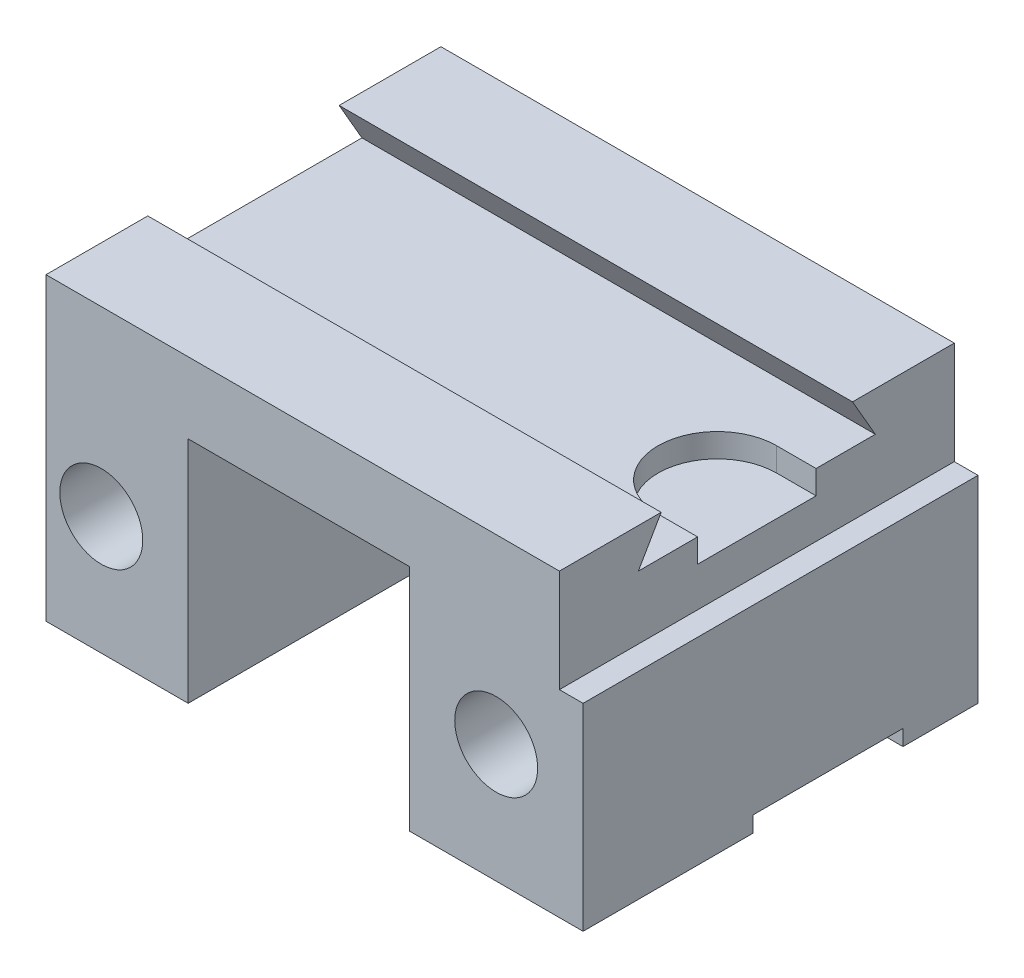
ISO-10303-21;
HEADER;
FILE_DESCRIPTION(('STEP AP214'),'2;1');
FILE_NAME('part.step','',(''),(''),'','','');
FILE_SCHEMA(('AUTOMOTIVE_DESIGN { 1 0 10303 214 1 1 1 1 }'));
ENDSEC;
DATA;
#1=APPLICATION_CONTEXT('core data for automotive mechanical design processes');
#2=APPLICATION_PROTOCOL_DEFINITION('international standard','automotive_design',2000,#1);
#3=PRODUCT_CONTEXT('',#1,'mechanical');
#4=PRODUCT('Part','Part','',(#3));
#5=PRODUCT_RELATED_PRODUCT_CATEGORY('part','',(#4));
#6=PRODUCT_DEFINITION_FORMATION('','',#4);
#7=PRODUCT_DEFINITION_CONTEXT('part definition',#1,'design');
#8=PRODUCT_DEFINITION('design','',#6,#7);
#9=PRODUCT_DEFINITION_SHAPE('','',#8);
#10=(LENGTH_UNIT() NAMED_UNIT(*) SI_UNIT(.MILLI.,.METRE.));
#11=(NAMED_UNIT(*) PLANE_ANGLE_UNIT() SI_UNIT($,.RADIAN.));
#12=(NAMED_UNIT(*) SI_UNIT($,.STERADIAN.) SOLID_ANGLE_UNIT());
#13=UNCERTAINTY_MEASURE_WITH_UNIT(LENGTH_MEASURE(1.E-05),#10,'distance_accuracy_value','');
#14=(GEOMETRIC_REPRESENTATION_CONTEXT(3) GLOBAL_UNCERTAINTY_ASSIGNED_CONTEXT((#13)) GLOBAL_UNIT_ASSIGNED_CONTEXT((#10,
#11,#12)) REPRESENTATION_CONTEXT('',''));
#15=CARTESIAN_POINT('',(0.,0.,0.));
#16=DIRECTION('',(0.,0.,1.));
#17=DIRECTION('',(1.,0.,0.));
#18=AXIS2_PLACEMENT_3D('',#15,#16,#17);
#19=CARTESIAN_POINT('',(0.,3.5,0.));
#20=DIRECTION('',(0.,-1.,0.));
#21=DIRECTION('',(0.,0.,-1.));
#22=AXIS2_PLACEMENT_3D('',#19,#20,#21);
#23=PLANE('',#22);
#24=DIRECTION('',(0.,0.,1.));
#25=VECTOR('',#24,1.);
#26=CARTESIAN_POINT('',(6.5,3.5,0.));
#27=LINE('',#26,#25);
#28=CARTESIAN_POINT('',(6.5,3.5,1.));
#29=VERTEX_POINT('',#28);
#30=CARTESIAN_POINT('',(6.5,3.5,1.75));
#31=VERTEX_POINT('',#30);
#32=EDGE_CURVE('E221',#29,#31,#27,.T.);
#33=ORIENTED_EDGE('',*,*,#32,.F.);
#34=DIRECTION('',(1.,0.,0.));
#35=VECTOR('',#34,1.);
#36=CARTESIAN_POINT('',(0.,3.5,1.));
#37=LINE('',#36,#35);
#38=CARTESIAN_POINT('',(0.,3.5,1.));
#39=VERTEX_POINT('',#38);
#40=EDGE_CURVE('E255',#39,#29,#37,.T.);
#41=ORIENTED_EDGE('',*,*,#40,.F.);
#42=DIRECTION('',(0.,0.,-1.));
#43=VECTOR('',#42,1.);
#44=CARTESIAN_POINT('',(0.,3.5,0.));
#45=LINE('',#44,#43);
#46=CARTESIAN_POINT('',(0.,3.5,4.));
#47=VERTEX_POINT('',#46);
#48=EDGE_CURVE('E245',#47,#39,#45,.T.);
#49=ORIENTED_EDGE('',*,*,#48,.F.);
#50=DIRECTION('',(1.,0.,0.));
#51=VECTOR('',#50,1.);
#52=CARTESIAN_POINT('',(0.,3.5,4.));
#53=LINE('',#52,#51);
#54=CARTESIAN_POINT('',(6.5,3.5,4.));
#55=VERTEX_POINT('',#54);
#56=EDGE_CURVE('E256',#47,#55,#53,.T.);
#57=ORIENTED_EDGE('',*,*,#56,.T.);
#58=CARTESIAN_POINT('',(6.5,3.5,3.25));
#59=VERTEX_POINT('',#58);
#60=EDGE_CURVE('E219',#59,#55,#27,.T.);
#61=ORIENTED_EDGE('',*,*,#60,.F.);
#62=DIRECTION('',(1.,0.,0.));
#63=VECTOR('',#62,1.);
#64=CARTESIAN_POINT('',(0.,3.5,3.25));
#65=LINE('',#64,#63);
#66=CARTESIAN_POINT('',(6.,3.5,3.25));
#67=VERTEX_POINT('',#66);
#68=EDGE_CURVE('E238',#67,#59,#65,.T.);
#69=ORIENTED_EDGE('',*,*,#68,.F.);
#70=CARTESIAN_POINT('',(6.,3.5,2.5));
#71=DIRECTION('',(0.,1.,0.));
#72=DIRECTION('',(0.,0.,1.));
#73=AXIS2_PLACEMENT_3D('',#70,#71,#72);
#74=CIRCLE('',#73,0.75);
#75=CARTESIAN_POINT('',(6.,3.5,1.75));
#76=VERTEX_POINT('',#75);
#77=EDGE_CURVE('E59',#76,#67,#74,.T.);
#78=ORIENTED_EDGE('',*,*,#77,.F.);
#79=DIRECTION('',(1.,0.,0.));
#80=VECTOR('',#79,1.);
#81=CARTESIAN_POINT('',(0.,3.5,1.75));
#82=LINE('',#81,#80);
#83=EDGE_CURVE('E230',#76,#31,#82,.T.);
#84=ORIENTED_EDGE('',*,*,#83,.T.);
#85=EDGE_LOOP('',(#33,#41,#49,#57,#61,#69,#78,#84));
#86=FACE_BOUND('',#85,.T.);
#87=ADVANCED_FACE('F37',(#86),#23,.F.);
#88=CARTESIAN_POINT('',(0.,4.,0.));
#89=DIRECTION('',(0.,1.,0.));
#90=DIRECTION('',(0.,0.,1.));
#91=AXIS2_PLACEMENT_3D('',#88,#89,#90);
#92=PLANE('',#91);
#93=DIRECTION('',(1.,0.,0.));
#94=VECTOR('',#93,1.);
#95=CARTESIAN_POINT('',(0.,4.,5.));
#96=LINE('',#95,#94);
#97=CARTESIAN_POINT('',(0.,4.,5.));
#98=VERTEX_POINT('',#97);
#99=CARTESIAN_POINT('',(6.5,4.,5.));
#100=VERTEX_POINT('',#99);
#101=EDGE_CURVE('E367',#98,#100,#96,.T.);
#102=ORIENTED_EDGE('',*,*,#101,.T.);
#103=DIRECTION('',(0.,0.,1.));
#104=VECTOR('',#103,1.);
#105=CARTESIAN_POINT('',(6.5,4.,5.));
#106=LINE('',#105,#104);
#107=CARTESIAN_POINT('',(6.5,4.,3.71132486540518));
#108=VERTEX_POINT('',#107);
#109=EDGE_CURVE('E199',#108,#100,#106,.T.);
#110=ORIENTED_EDGE('',*,*,#109,.F.);
#111=DIRECTION('',(1.,0.,0.));
#112=VECTOR('',#111,1.);
#113=CARTESIAN_POINT('',(0.,4.,3.71132486540518));
#114=LINE('',#113,#112);
#115=CARTESIAN_POINT('',(0.,4.,3.71132486540518));
#116=VERTEX_POINT('',#115);
#117=EDGE_CURVE('E260',#116,#108,#114,.T.);
#118=ORIENTED_EDGE('',*,*,#117,.F.);
#119=DIRECTION('',(0.,0.,1.));
#120=VECTOR('',#119,1.);
#121=CARTESIAN_POINT('',(0.,4.,0.));
#122=LINE('',#121,#120);
#123=EDGE_CURVE('E363',#116,#98,#122,.T.);
#124=ORIENTED_EDGE('',*,*,#123,.T.);
#125=EDGE_LOOP('',(#102,#110,#118,#124));
#126=FACE_BOUND('',#125,.T.);
#127=ADVANCED_FACE('F413',(#126),#92,.T.);
#128=DIRECTION('',(1.,0.,0.));
#129=VECTOR('',#128,1.);
#130=CARTESIAN_POINT('',(0.,4.,1.28867513459482));
#131=LINE('',#130,#129);
#132=CARTESIAN_POINT('',(0.,4.,1.28867513459482));
#133=VERTEX_POINT('',#132);
#134=CARTESIAN_POINT('',(6.5,4.,1.28867513459482));
#135=VERTEX_POINT('',#134);
#136=EDGE_CURVE('E263',#133,#135,#131,.T.);
#137=ORIENTED_EDGE('',*,*,#136,.T.);
#138=CARTESIAN_POINT('',(6.5,4.,0.));
#139=VERTEX_POINT('',#138);
#140=EDGE_CURVE('E210',#139,#135,#106,.T.);
#141=ORIENTED_EDGE('',*,*,#140,.F.);
#142=DIRECTION('',(-1.,0.,0.));
#143=VECTOR('',#142,1.);
#144=CARTESIAN_POINT('',(6.8,4.,0.));
#145=LINE('',#144,#143);
#146=CARTESIAN_POINT('',(0.,4.,0.));
#147=VERTEX_POINT('',#146);
#148=EDGE_CURVE('E337',#139,#147,#145,.T.);
#149=ORIENTED_EDGE('',*,*,#148,.T.);
#150=EDGE_CURVE('E364',#147,#133,#122,.T.);
#151=ORIENTED_EDGE('',*,*,#150,.T.);
#152=EDGE_LOOP('',(#137,#141,#149,#151));
#153=FACE_BOUND('',#152,.T.);
#154=ADVANCED_FACE('F386',(#153),#92,.T.);
#155=CARTESIAN_POINT('',(0.,2.6070508075689,4.51554445662276));
#156=DIRECTION('',(0.,0.500000000000004,0.866025403784436));
#157=DIRECTION('',(0.,-0.866025403784436,0.500000000000004));
#158=AXIS2_PLACEMENT_3D('',#155,#156,#157);
#159=PLANE('',#158);
#160=DIRECTION('',(0.,0.866025403784436,-0.500000000000004));
#161=VECTOR('',#160,1.);
#162=CARTESIAN_POINT('',(6.5,2.6070508075689,4.51554445662276));
#163=LINE('',#162,#161);
#164=EDGE_CURVE('E224',#55,#108,#163,.T.);
#165=ORIENTED_EDGE('',*,*,#164,.F.);
#166=ORIENTED_EDGE('',*,*,#56,.F.);
#167=DIRECTION('',(0.,-0.866025403784436,0.500000000000004));
#168=VECTOR('',#167,1.);
#169=CARTESIAN_POINT('',(0.,2.6070508075689,4.51554445662276));
#170=LINE('',#169,#168);
#171=EDGE_CURVE('E252',#116,#47,#170,.T.);
#172=ORIENTED_EDGE('',*,*,#171,.F.);
#173=ORIENTED_EDGE('',*,*,#117,.T.);
#174=EDGE_LOOP('',(#165,#166,#172,#173));
#175=FACE_BOUND('',#174,.T.);
#176=ADVANCED_FACE('F410',(#175),#159,.F.);
#177=CARTESIAN_POINT('',(0.,0.441987298107791,-0.765544456622779));
#178=DIRECTION('',(0.,0.500000000000004,-0.866025403784437));
#179=DIRECTION('',(0.,0.866025403784437,0.500000000000004));
#180=AXIS2_PLACEMENT_3D('',#177,#178,#179);
#181=PLANE('',#180);
#182=DIRECTION('',(0.,-0.866025403784437,-0.500000000000004));
#183=VECTOR('',#182,1.);
#184=CARTESIAN_POINT('',(6.5,0.441987298107791,-0.765544456622779));
#185=LINE('',#184,#183);
#186=EDGE_CURVE('E222',#135,#29,#185,.T.);
#187=ORIENTED_EDGE('',*,*,#186,.F.);
#188=ORIENTED_EDGE('',*,*,#136,.F.);
#189=DIRECTION('',(0.,0.866025403784437,0.500000000000004));
#190=VECTOR('',#189,1.);
#191=CARTESIAN_POINT('',(0.,0.441987298107791,-0.765544456622779));
#192=LINE('',#191,#190);
#193=EDGE_CURVE('E249',#39,#133,#192,.T.);
#194=ORIENTED_EDGE('',*,*,#193,.F.);
#195=ORIENTED_EDGE('',*,*,#40,.T.);
#196=EDGE_LOOP('',(#187,#188,#194,#195));
#197=FACE_BOUND('',#196,.T.);
#198=ADVANCED_FACE('F391',(#197),#181,.F.);
#199=CARTESIAN_POINT('',(0.,3.2,1.75));
#200=DIRECTION('',(0.,0.,1.));
#201=DIRECTION('',(1.,0.,0.));
#202=AXIS2_PLACEMENT_3D('',#199,#200,#201);
#203=PLANE('',#202);
#204=DIRECTION('',(1.,0.,0.));
#205=VECTOR('',#204,1.);
#206=CARTESIAN_POINT('',(0.,3.2,1.75));
#207=LINE('',#206,#205);
#208=CARTESIAN_POINT('',(6.,3.2,1.75));
#209=VERTEX_POINT('',#208);
#210=CARTESIAN_POINT('',(6.5,3.2,1.75));
#211=VERTEX_POINT('',#210);
#212=EDGE_CURVE('E233',#209,#211,#207,.T.);
#213=ORIENTED_EDGE('',*,*,#212,.T.);
#214=DIRECTION('',(0.,1.,0.));
#215=VECTOR('',#214,1.);
#216=CARTESIAN_POINT('',(6.5,3.2,1.75));
#217=LINE('',#216,#215);
#218=EDGE_CURVE('E52',#211,#31,#217,.T.);
#219=ORIENTED_EDGE('',*,*,#218,.T.);
#220=ORIENTED_EDGE('',*,*,#83,.F.);
#221=DIRECTION('',(0.,1.,0.));
#222=VECTOR('',#221,1.);
#223=CARTESIAN_POINT('',(6.,3.2,1.75));
#224=LINE('',#223,#222);
#225=EDGE_CURVE('E243',#209,#76,#224,.T.);
#226=ORIENTED_EDGE('',*,*,#225,.F.);
#227=EDGE_LOOP('',(#213,#219,#220,#226));
#228=FACE_BOUND('',#227,.T.);
#229=ADVANCED_FACE('F396',(#228),#203,.T.);
#230=CARTESIAN_POINT('',(0.,3.2,3.25));
#231=DIRECTION('',(0.,0.,1.));
#232=DIRECTION('',(0.,-1.,0.));
#233=AXIS2_PLACEMENT_3D('',#230,#231,#232);
#234=PLANE('',#233);
#235=DIRECTION('',(0.,1.,0.));
#236=VECTOR('',#235,1.);
#237=CARTESIAN_POINT('',(6.5,3.2,3.25));
#238=LINE('',#237,#236);
#239=CARTESIAN_POINT('',(6.5,3.2,3.25));
#240=VERTEX_POINT('',#239);
#241=EDGE_CURVE('E212',#240,#59,#238,.T.);
#242=ORIENTED_EDGE('',*,*,#241,.F.);
#243=DIRECTION('',(1.,0.,0.));
#244=VECTOR('',#243,1.);
#245=CARTESIAN_POINT('',(0.,3.2,3.25));
#246=LINE('',#245,#244);
#247=CARTESIAN_POINT('',(6.,3.2,3.25));
#248=VERTEX_POINT('',#247);
#249=EDGE_CURVE('E229',#248,#240,#246,.T.);
#250=ORIENTED_EDGE('',*,*,#249,.F.);
#251=DIRECTION('',(0.,1.,0.));
#252=VECTOR('',#251,1.);
#253=CARTESIAN_POINT('',(6.,3.2,3.25));
#254=LINE('',#253,#252);
#255=EDGE_CURVE('E236',#248,#67,#254,.T.);
#256=ORIENTED_EDGE('',*,*,#255,.T.);
#257=ORIENTED_EDGE('',*,*,#68,.T.);
#258=EDGE_LOOP('',(#242,#250,#256,#257));
#259=FACE_BOUND('',#258,.T.);
#260=ADVANCED_FACE('F406',(#259),#234,.F.);
#261=CARTESIAN_POINT('',(0.,3.2,0.));
#262=DIRECTION('',(0.,1.,0.));
#263=DIRECTION('',(0.,0.,1.));
#264=AXIS2_PLACEMENT_3D('',#261,#262,#263);
#265=PLANE('',#264);
#266=ORIENTED_EDGE('',*,*,#249,.T.);
#267=DIRECTION('',(0.,0.,-1.));
#268=VECTOR('',#267,1.);
#269=CARTESIAN_POINT('',(6.5,3.2,0.));
#270=LINE('',#269,#268);
#271=EDGE_CURVE('E11',#240,#211,#270,.T.);
#272=ORIENTED_EDGE('',*,*,#271,.T.);
#273=ORIENTED_EDGE('',*,*,#212,.F.);
#274=CARTESIAN_POINT('',(6.,3.2,2.5));
#275=DIRECTION('',(0.,1.,0.));
#276=DIRECTION('',(0.,0.,1.));
#277=AXIS2_PLACEMENT_3D('',#274,#275,#276);
#278=CIRCLE('',#277,0.75);
#279=EDGE_CURVE('E226',#209,#248,#278,.T.);
#280=ORIENTED_EDGE('',*,*,#279,.T.);
#281=EDGE_LOOP('',(#266,#272,#273,#280));
#282=FACE_BOUND('',#281,.T.);
#283=ADVANCED_FACE('F400',(#282),#265,.T.);
#284=CARTESIAN_POINT('',(6.8,0.2,5.));
#285=DIRECTION('',(1.,0.,0.));
#286=DIRECTION('',(0.,0.,-1.));
#287=AXIS2_PLACEMENT_3D('',#284,#285,#286);
#288=PLANE('',#287);
#289=DIRECTION('',(0.,0.,-1.));
#290=VECTOR('',#289,1.);
#291=CARTESIAN_POINT('',(6.8,2.7,5.));
#292=LINE('',#291,#290);
#293=CARTESIAN_POINT('',(6.8,2.7,5.));
#294=VERTEX_POINT('',#293);
#295=CARTESIAN_POINT('',(6.8,2.7,0.));
#296=VERTEX_POINT('',#295);
#297=EDGE_CURVE('E203',#294,#296,#292,.T.);
#298=ORIENTED_EDGE('',*,*,#297,.F.);
#299=DIRECTION('',(0.,1.,0.));
#300=VECTOR('',#299,1.);
#301=CARTESIAN_POINT('',(6.8,0.2,5.));
#302=LINE('',#301,#300);
#303=CARTESIAN_POINT('',(6.8,0.2,5.));
#304=VERTEX_POINT('',#303);
#305=EDGE_CURVE('E209',#304,#294,#302,.T.);
#306=ORIENTED_EDGE('',*,*,#305,.F.);
#307=DIRECTION('',(0.,0.,-1.));
#308=VECTOR('',#307,1.);
#309=CARTESIAN_POINT('',(6.8,0.2,5.));
#310=LINE('',#309,#308);
#311=CARTESIAN_POINT('',(6.8,0.2,2.85));
#312=VERTEX_POINT('',#311);
#313=EDGE_CURVE('E358',#304,#312,#310,.T.);
#314=ORIENTED_EDGE('',*,*,#313,.T.);
#315=DIRECTION('',(0.,-1.,0.));
#316=VECTOR('',#315,1.);
#317=CARTESIAN_POINT('',(6.8,0.4,2.85));
#318=LINE('',#317,#316);
#319=CARTESIAN_POINT('',(6.8,0.4,2.85));
#320=VERTEX_POINT('',#319);
#321=EDGE_CURVE('E291',#320,#312,#318,.T.);
#322=ORIENTED_EDGE('',*,*,#321,.F.);
#323=DIRECTION('',(0.,0.,1.));
#324=VECTOR('',#323,1.);
#325=CARTESIAN_POINT('',(6.8,0.4,0.95));
#326=LINE('',#325,#324);
#327=CARTESIAN_POINT('',(6.8,0.4,0.95));
#328=VERTEX_POINT('',#327);
#329=EDGE_CURVE('E296',#328,#320,#326,.T.);
#330=ORIENTED_EDGE('',*,*,#329,.F.);
#331=DIRECTION('',(0.,1.,0.));
#332=VECTOR('',#331,1.);
#333=CARTESIAN_POINT('',(6.8,0.2,0.95));
#334=LINE('',#333,#332);
#335=CARTESIAN_POINT('',(6.8,0.2,0.95));
#336=VERTEX_POINT('',#335);
#337=EDGE_CURVE('E304',#336,#328,#334,.T.);
#338=ORIENTED_EDGE('',*,*,#337,.F.);
#339=CARTESIAN_POINT('',(6.8,0.2,0.));
#340=VERTEX_POINT('',#339);
#341=EDGE_CURVE('E357',#336,#340,#310,.T.);
#342=ORIENTED_EDGE('',*,*,#341,.T.);
#343=DIRECTION('',(0.,1.,0.));
#344=VECTOR('',#343,1.);
#345=CARTESIAN_POINT('',(6.8,0.2,0.));
#346=LINE('',#345,#344);
#347=EDGE_CURVE('E45',#340,#296,#346,.T.);
#348=ORIENTED_EDGE('',*,*,#347,.T.);
#349=EDGE_LOOP('',(#298,#306,#314,#322,#330,#338,#342,#348));
#350=FACE_BOUND('',#349,.T.);
#351=ADVANCED_FACE('F419',(#350),#288,.T.);
#352=CARTESIAN_POINT('',(0.,0.2,0.));
#353=DIRECTION('',(0.,1.,0.));
#354=DIRECTION('',(0.,0.,1.));
#355=AXIS2_PLACEMENT_3D('',#352,#353,#354);
#356=PLANE('',#355);
#357=DIRECTION('',(0.,0.,1.));
#358=VECTOR('',#357,1.);
#359=CARTESIAN_POINT('',(4.6,0.2,0.));
#360=LINE('',#359,#358);
#361=CARTESIAN_POINT('',(4.6,0.2,2.85));
#362=VERTEX_POINT('',#361);
#363=CARTESIAN_POINT('',(4.6,0.2,5.));
#364=VERTEX_POINT('',#363);
#365=EDGE_CURVE('E343',#362,#364,#360,.T.);
#366=ORIENTED_EDGE('',*,*,#365,.F.);
#367=DIRECTION('',(1.,0.,0.));
#368=VECTOR('',#367,1.);
#369=CARTESIAN_POINT('',(4.6,0.2,2.85));
#370=LINE('',#369,#368);
#371=EDGE_CURVE('E302',#362,#312,#370,.T.);
#372=ORIENTED_EDGE('',*,*,#371,.T.);
#373=ORIENTED_EDGE('',*,*,#313,.F.);
#374=DIRECTION('',(1.,0.,0.));
#375=VECTOR('',#374,1.);
#376=CARTESIAN_POINT('',(0.,0.2,5.));
#377=LINE('',#376,#375);
#378=EDGE_CURVE('E353',#364,#304,#377,.T.);
#379=ORIENTED_EDGE('',*,*,#378,.F.);
#380=EDGE_LOOP('',(#366,#372,#373,#379));
#381=FACE_BOUND('',#380,.T.);
#382=ADVANCED_FACE('F445',(#381),#356,.F.);
#383=DIRECTION('',(-1.,0.,0.));
#384=VECTOR('',#383,1.);
#385=CARTESIAN_POINT('',(6.8,0.2,0.));
#386=LINE('',#385,#384);
#387=CARTESIAN_POINT('',(1.8,0.2,0.));
#388=VERTEX_POINT('',#387);
#389=CARTESIAN_POINT('',(0.,0.2,0.));
#390=VERTEX_POINT('',#389);
#391=EDGE_CURVE('E350',#388,#390,#386,.T.);
#392=ORIENTED_EDGE('',*,*,#391,.F.);
#393=DIRECTION('',(0.,0.,1.));
#394=VECTOR('',#393,1.);
#395=CARTESIAN_POINT('',(1.8,0.2,0.));
#396=LINE('',#395,#394);
#397=CARTESIAN_POINT('',(1.8,0.2,5.));
#398=VERTEX_POINT('',#397);
#399=EDGE_CURVE('E328',#388,#398,#396,.T.);
#400=ORIENTED_EDGE('',*,*,#399,.T.);
#401=CARTESIAN_POINT('',(0.,0.2,5.));
#402=VERTEX_POINT('',#401);
#403=EDGE_CURVE('E354',#402,#398,#377,.T.);
#404=ORIENTED_EDGE('',*,*,#403,.F.);
#405=DIRECTION('',(0.,0.,1.));
#406=VECTOR('',#405,1.);
#407=CARTESIAN_POINT('',(0.,0.2,0.));
#408=LINE('',#407,#406);
#409=EDGE_CURVE('E349',#390,#402,#408,.T.);
#410=ORIENTED_EDGE('',*,*,#409,.F.);
#411=EDGE_LOOP('',(#392,#400,#404,#410));
#412=FACE_BOUND('',#411,.T.);
#413=ADVANCED_FACE('F439',(#412),#356,.F.);
#414=CARTESIAN_POINT('',(6.8,0.2,0.));
#415=DIRECTION('',(0.,0.,-1.));
#416=DIRECTION('',(-1.,0.,0.));
#417=AXIS2_PLACEMENT_3D('',#414,#415,#416);
#418=PLANE('',#417);
#419=DIRECTION('',(1.,0.,0.));
#420=VECTOR('',#419,1.);
#421=CARTESIAN_POINT('',(6.5,2.7,0.));
#422=LINE('',#421,#420);
#423=CARTESIAN_POINT('',(6.5,2.7,0.));
#424=VERTEX_POINT('',#423);
#425=EDGE_CURVE('E191',#424,#296,#422,.T.);
#426=ORIENTED_EDGE('',*,*,#425,.T.);
#427=ORIENTED_EDGE('',*,*,#347,.F.);
#428=CARTESIAN_POINT('',(4.6,0.2,0.));
#429=VERTEX_POINT('',#428);
#430=EDGE_CURVE('E346',#340,#429,#386,.T.);
#431=ORIENTED_EDGE('',*,*,#430,.T.);
#432=DIRECTION('',(0.,1.,0.));
#433=VECTOR('',#432,1.);
#434=CARTESIAN_POINT('',(4.6,0.2,0.));
#435=LINE('',#434,#433);
#436=CARTESIAN_POINT('',(4.6,3.1,0.));
#437=VERTEX_POINT('',#436);
#438=EDGE_CURVE('E321',#429,#437,#435,.T.);
#439=ORIENTED_EDGE('',*,*,#438,.T.);
#440=DIRECTION('',(-1.,0.,0.));
#441=VECTOR('',#440,1.);
#442=CARTESIAN_POINT('',(4.6,3.1,0.));
#443=LINE('',#442,#441);
#444=CARTESIAN_POINT('',(1.8,3.1,0.));
#445=VERTEX_POINT('',#444);
#446=EDGE_CURVE('E325',#437,#445,#443,.T.);
#447=ORIENTED_EDGE('',*,*,#446,.T.);
#448=DIRECTION('',(0.,-1.,0.));
#449=VECTOR('',#448,1.);
#450=CARTESIAN_POINT('',(1.8,3.1,0.));
#451=LINE('',#450,#449);
#452=EDGE_CURVE('E318',#445,#388,#451,.T.);
#453=ORIENTED_EDGE('',*,*,#452,.T.);
#454=ORIENTED_EDGE('',*,*,#391,.T.);
#455=DIRECTION('',(0.,1.,0.));
#456=VECTOR('',#455,1.);
#457=CARTESIAN_POINT('',(0.,0.2,0.));
#458=LINE('',#457,#456);
#459=EDGE_CURVE('E361',#390,#147,#458,.T.);
#460=ORIENTED_EDGE('',*,*,#459,.T.);
#461=ORIENTED_EDGE('',*,*,#148,.F.);
#462=DIRECTION('',(0.,1.,0.));
#463=VECTOR('',#462,1.);
#464=CARTESIAN_POINT('',(6.5,4.,0.));
#465=LINE('',#464,#463);
#466=EDGE_CURVE('E193',#424,#139,#465,.T.);
#467=ORIENTED_EDGE('',*,*,#466,.F.);
#468=EDGE_LOOP('',(#426,#427,#431,#439,#447,#453,#454,#460,#461,#467));
#469=FACE_BOUND('',#468,.T.);
#470=CARTESIAN_POINT('',(5.7,1.7,0.));
#471=DIRECTION('',(0.,0.,-1.));
#472=DIRECTION('',(-1.,0.,0.));
#473=AXIS2_PLACEMENT_3D('',#470,#471,#472);
#474=CIRCLE('',#473,0.650000000000015);
#475=CARTESIAN_POINT('',(5.04999999999998,1.7,0.));
#476=VERTEX_POINT('',#475);
#477=EDGE_CURVE('E259',#476,#476,#474,.T.);
#478=ORIENTED_EDGE('',*,*,#477,.F.);
#479=EDGE_LOOP('',(#478));
#480=FACE_BOUND('',#479,.T.);
#481=CARTESIAN_POINT('',(0.700000000000001,1.7,0.));
#482=DIRECTION('',(0.,0.,-1.));
#483=DIRECTION('',(-1.,0.,0.));
#484=AXIS2_PLACEMENT_3D('',#481,#482,#483);
#485=CIRCLE('',#484,0.650000000000015);
#486=CARTESIAN_POINT('',(0.0499999999999854,1.7,0.));
#487=VERTEX_POINT('',#486);
#488=EDGE_CURVE('E279',#487,#487,#485,.T.);
#489=ORIENTED_EDGE('',*,*,#488,.F.);
#490=EDGE_LOOP('',(#489));
#491=FACE_BOUND('',#490,.T.);
#492=ADVANCED_FACE('F39',(#469,#480,#491),#418,.T.);
#493=CARTESIAN_POINT('',(0.,0.2,5.));
#494=DIRECTION('',(0.,0.,1.));
#495=DIRECTION('',(1.,0.,0.));
#496=AXIS2_PLACEMENT_3D('',#493,#494,#495);
#497=PLANE('',#496);
#498=DIRECTION('',(1.,0.,0.));
#499=VECTOR('',#498,1.);
#500=CARTESIAN_POINT('',(6.5,2.7,5.));
#501=LINE('',#500,#499);
#502=CARTESIAN_POINT('',(6.5,2.7,5.));
#503=VERTEX_POINT('',#502);
#504=EDGE_CURVE('E188',#503,#294,#501,.T.);
#505=ORIENTED_EDGE('',*,*,#504,.F.);
#506=DIRECTION('',(0.,-1.,0.));
#507=VECTOR('',#506,1.);
#508=CARTESIAN_POINT('',(6.5,4.,5.));
#509=LINE('',#508,#507);
#510=EDGE_CURVE('E194',#100,#503,#509,.T.);
#511=ORIENTED_EDGE('',*,*,#510,.F.);
#512=ORIENTED_EDGE('',*,*,#101,.F.);
#513=DIRECTION('',(0.,1.,0.));
#514=VECTOR('',#513,1.);
#515=CARTESIAN_POINT('',(0.,0.2,5.));
#516=LINE('',#515,#514);
#517=EDGE_CURVE('E372',#402,#98,#516,.T.);
#518=ORIENTED_EDGE('',*,*,#517,.F.);
#519=ORIENTED_EDGE('',*,*,#403,.T.);
#520=DIRECTION('',(0.,-1.,0.));
#521=VECTOR('',#520,1.);
#522=CARTESIAN_POINT('',(1.8,3.1,5.));
#523=LINE('',#522,#521);
#524=CARTESIAN_POINT('',(1.8,3.1,5.));
#525=VERTEX_POINT('',#524);
#526=EDGE_CURVE('E311',#525,#398,#523,.T.);
#527=ORIENTED_EDGE('',*,*,#526,.F.);
#528=DIRECTION('',(-1.,0.,0.));
#529=VECTOR('',#528,1.);
#530=CARTESIAN_POINT('',(4.6,3.1,5.));
#531=LINE('',#530,#529);
#532=CARTESIAN_POINT('',(4.6,3.1,5.));
#533=VERTEX_POINT('',#532);
#534=EDGE_CURVE('E322',#533,#525,#531,.T.);
#535=ORIENTED_EDGE('',*,*,#534,.F.);
#536=DIRECTION('',(0.,1.,0.));
#537=VECTOR('',#536,1.);
#538=CARTESIAN_POINT('',(4.6,0.2,5.));
#539=LINE('',#538,#537);
#540=EDGE_CURVE('E330',#364,#533,#539,.T.);
#541=ORIENTED_EDGE('',*,*,#540,.F.);
#542=ORIENTED_EDGE('',*,*,#378,.T.);
#543=ORIENTED_EDGE('',*,*,#305,.T.);
#544=EDGE_LOOP('',(#505,#511,#512,#518,#519,#527,#535,#541,#542,#543));
#545=FACE_BOUND('',#544,.T.);
#546=CARTESIAN_POINT('',(5.7,1.7,5.));
#547=DIRECTION('',(0.,0.,-1.));
#548=DIRECTION('',(-1.,0.,0.));
#549=AXIS2_PLACEMENT_3D('',#546,#547,#548);
#550=CIRCLE('',#549,0.525000000000013);
#551=CARTESIAN_POINT('',(5.17499999999999,1.7,5.));
#552=VERTEX_POINT('',#551);
#553=EDGE_CURVE('E276',#552,#552,#550,.T.);
#554=ORIENTED_EDGE('',*,*,#553,.T.);
#555=EDGE_LOOP('',(#554));
#556=FACE_BOUND('',#555,.T.);
#557=CARTESIAN_POINT('',(0.700000000000001,1.7,5.));
#558=DIRECTION('',(0.,0.,-1.));
#559=DIRECTION('',(-1.,0.,0.));
#560=AXIS2_PLACEMENT_3D('',#557,#558,#559);
#561=CIRCLE('',#560,0.525000000000013);
#562=CARTESIAN_POINT('',(0.174999999999988,1.7,5.));
#563=VERTEX_POINT('',#562);
#564=EDGE_CURVE('E288',#563,#563,#561,.T.);
#565=ORIENTED_EDGE('',*,*,#564,.T.);
#566=EDGE_LOOP('',(#565));
#567=FACE_BOUND('',#566,.T.);
#568=ADVANCED_FACE('F206',(#545,#556,#567),#497,.T.);
#569=CARTESIAN_POINT('',(0.,0.2,0.));
#570=DIRECTION('',(-1.,0.,0.));
#571=DIRECTION('',(0.,0.,1.));
#572=AXIS2_PLACEMENT_3D('',#569,#570,#571);
#573=PLANE('',#572);
#574=ORIENTED_EDGE('',*,*,#171,.T.);
#575=ORIENTED_EDGE('',*,*,#48,.T.);
#576=ORIENTED_EDGE('',*,*,#193,.T.);
#577=ORIENTED_EDGE('',*,*,#150,.F.);
#578=ORIENTED_EDGE('',*,*,#459,.F.);
#579=ORIENTED_EDGE('',*,*,#409,.T.);
#580=ORIENTED_EDGE('',*,*,#517,.T.);
#581=ORIENTED_EDGE('',*,*,#123,.F.);
#582=EDGE_LOOP('',(#574,#575,#576,#577,#578,#579,#580,#581));
#583=FACE_BOUND('',#582,.T.);
#584=ADVANCED_FACE('F383',(#583),#573,.T.);
#585=ORIENTED_EDGE('',*,*,#341,.F.);
#586=DIRECTION('',(1.,0.,0.));
#587=VECTOR('',#586,1.);
#588=CARTESIAN_POINT('',(4.6,0.2,0.95));
#589=LINE('',#588,#587);
#590=CARTESIAN_POINT('',(4.6,0.2,0.95));
#591=VERTEX_POINT('',#590);
#592=EDGE_CURVE('E314',#591,#336,#589,.T.);
#593=ORIENTED_EDGE('',*,*,#592,.F.);
#594=EDGE_CURVE('E340',#429,#591,#360,.T.);
#595=ORIENTED_EDGE('',*,*,#594,.F.);
#596=ORIENTED_EDGE('',*,*,#430,.F.);
#597=EDGE_LOOP('',(#585,#593,#595,#596));
#598=FACE_BOUND('',#597,.T.);
#599=ADVANCED_FACE('F425',(#598),#356,.F.);
#600=CARTESIAN_POINT('',(1.8,3.1,0.));
#601=DIRECTION('',(-1.,0.,0.));
#602=DIRECTION('',(0.,-1.,0.));
#603=AXIS2_PLACEMENT_3D('',#600,#601,#602);
#604=PLANE('',#603);
#605=ORIENTED_EDGE('',*,*,#526,.T.);
#606=ORIENTED_EDGE('',*,*,#399,.F.);
#607=ORIENTED_EDGE('',*,*,#452,.F.);
#608=DIRECTION('',(0.,0.,1.));
#609=VECTOR('',#608,1.);
#610=CARTESIAN_POINT('',(1.8,3.1,0.));
#611=LINE('',#610,#609);
#612=EDGE_CURVE('E335',#445,#525,#611,.T.);
#613=ORIENTED_EDGE('',*,*,#612,.T.);
#614=EDGE_LOOP('',(#605,#606,#607,#613));
#615=FACE_BOUND('',#614,.T.);
#616=ADVANCED_FACE('F437',(#615),#604,.F.);
#617=CARTESIAN_POINT('',(4.6,3.1,0.));
#618=DIRECTION('',(0.,1.,0.));
#619=DIRECTION('',(-1.,0.,0.));
#620=AXIS2_PLACEMENT_3D('',#617,#618,#619);
#621=PLANE('',#620);
#622=ORIENTED_EDGE('',*,*,#534,.T.);
#623=ORIENTED_EDGE('',*,*,#612,.F.);
#624=ORIENTED_EDGE('',*,*,#446,.F.);
#625=DIRECTION('',(0.,0.,1.));
#626=VECTOR('',#625,1.);
#627=CARTESIAN_POINT('',(4.6,3.1,0.));
#628=LINE('',#627,#626);
#629=EDGE_CURVE('E338',#437,#533,#628,.T.);
#630=ORIENTED_EDGE('',*,*,#629,.T.);
#631=EDGE_LOOP('',(#622,#623,#624,#630));
#632=FACE_BOUND('',#631,.T.);
#633=ADVANCED_FACE('F433',(#632),#621,.F.);
#634=CARTESIAN_POINT('',(4.6,0.2,0.));
#635=DIRECTION('',(1.,0.,0.));
#636=DIRECTION('',(0.,1.,0.));
#637=AXIS2_PLACEMENT_3D('',#634,#635,#636);
#638=PLANE('',#637);
#639=DIRECTION('',(0.,0.,1.));
#640=VECTOR('',#639,1.);
#641=CARTESIAN_POINT('',(4.6,0.4,0.95));
#642=LINE('',#641,#640);
#643=CARTESIAN_POINT('',(4.6,0.4,0.95));
#644=VERTEX_POINT('',#643);
#645=CARTESIAN_POINT('',(4.6,0.4,2.85));
#646=VERTEX_POINT('',#645);
#647=EDGE_CURVE('E299',#644,#646,#642,.T.);
#648=ORIENTED_EDGE('',*,*,#647,.T.);
#649=DIRECTION('',(0.,-1.,0.));
#650=VECTOR('',#649,1.);
#651=CARTESIAN_POINT('',(4.6,0.4,2.85));
#652=LINE('',#651,#650);
#653=EDGE_CURVE('E292',#646,#362,#652,.T.);
#654=ORIENTED_EDGE('',*,*,#653,.T.);
#655=ORIENTED_EDGE('',*,*,#365,.T.);
#656=ORIENTED_EDGE('',*,*,#540,.T.);
#657=ORIENTED_EDGE('',*,*,#629,.F.);
#658=ORIENTED_EDGE('',*,*,#438,.F.);
#659=ORIENTED_EDGE('',*,*,#594,.T.);
#660=DIRECTION('',(0.,1.,0.));
#661=VECTOR('',#660,1.);
#662=CARTESIAN_POINT('',(4.6,0.2,0.95));
#663=LINE('',#662,#661);
#664=EDGE_CURVE('E295',#591,#644,#663,.T.);
#665=ORIENTED_EDGE('',*,*,#664,.T.);
#666=EDGE_LOOP('',(#648,#654,#655,#656,#657,#658,#659,#665));
#667=FACE_BOUND('',#666,.T.);
#668=ADVANCED_FACE('F429',(#667),#638,.F.);
#669=CARTESIAN_POINT('',(4.6,0.4,2.85));
#670=DIRECTION('',(0.,0.,1.));
#671=DIRECTION('',(1.,0.,0.));
#672=AXIS2_PLACEMENT_3D('',#669,#670,#671);
#673=PLANE('',#672);
#674=ORIENTED_EDGE('',*,*,#321,.T.);
#675=ORIENTED_EDGE('',*,*,#371,.F.);
#676=ORIENTED_EDGE('',*,*,#653,.F.);
#677=DIRECTION('',(1.,0.,0.));
#678=VECTOR('',#677,1.);
#679=CARTESIAN_POINT('',(4.6,0.4,2.85));
#680=LINE('',#679,#678);
#681=EDGE_CURVE('E309',#646,#320,#680,.T.);
#682=ORIENTED_EDGE('',*,*,#681,.T.);
#683=EDGE_LOOP('',(#674,#675,#676,#682));
#684=FACE_BOUND('',#683,.T.);
#685=ADVANCED_FACE('F448',(#684),#673,.F.);
#686=CARTESIAN_POINT('',(4.6,0.4,0.95));
#687=DIRECTION('',(0.,1.,0.));
#688=DIRECTION('',(0.,0.,1.));
#689=AXIS2_PLACEMENT_3D('',#686,#687,#688);
#690=PLANE('',#689);
#691=ORIENTED_EDGE('',*,*,#329,.T.);
#692=ORIENTED_EDGE('',*,*,#681,.F.);
#693=ORIENTED_EDGE('',*,*,#647,.F.);
#694=DIRECTION('',(1.,0.,0.));
#695=VECTOR('',#694,1.);
#696=CARTESIAN_POINT('',(4.6,0.4,0.95));
#697=LINE('',#696,#695);
#698=EDGE_CURVE('E312',#644,#328,#697,.T.);
#699=ORIENTED_EDGE('',*,*,#698,.T.);
#700=EDGE_LOOP('',(#691,#692,#693,#699));
#701=FACE_BOUND('',#700,.T.);
#702=ADVANCED_FACE('F451',(#701),#690,.F.);
#703=CARTESIAN_POINT('',(4.6,0.2,0.95));
#704=DIRECTION('',(0.,0.,-1.));
#705=DIRECTION('',(-1.,0.,0.));
#706=AXIS2_PLACEMENT_3D('',#703,#704,#705);
#707=PLANE('',#706);
#708=ORIENTED_EDGE('',*,*,#337,.T.);
#709=ORIENTED_EDGE('',*,*,#698,.F.);
#710=ORIENTED_EDGE('',*,*,#664,.F.);
#711=ORIENTED_EDGE('',*,*,#592,.T.);
#712=EDGE_LOOP('',(#708,#709,#710,#711));
#713=FACE_BOUND('',#712,.T.);
#714=ADVANCED_FACE('F454',(#713),#707,.F.);
#715=CARTESIAN_POINT('',(0.700000000000001,1.7,0.));
#716=DIRECTION('',(0.,0.,-1.));
#717=DIRECTION('',(-1.,0.,0.));
#718=AXIS2_PLACEMENT_3D('',#715,#716,#717);
#719=CYLINDRICAL_SURFACE('',#718,0.525000000000013);
#720=ORIENTED_EDGE('',*,*,#564,.F.);
#721=EDGE_LOOP('',(#720));
#722=FACE_BOUND('',#721,.T.);
#723=CARTESIAN_POINT('',(0.700000000000001,1.7,1.2));
#724=DIRECTION('',(0.,0.,-1.));
#725=DIRECTION('',(-1.,0.,0.));
#726=AXIS2_PLACEMENT_3D('',#723,#724,#725);
#727=CIRCLE('',#726,0.525000000000013);
#728=CARTESIAN_POINT('',(0.174999999999987,1.7,1.2));
#729=VERTEX_POINT('',#728);
#730=EDGE_CURVE('E285',#729,#729,#727,.T.);
#731=ORIENTED_EDGE('',*,*,#730,.T.);
#732=EDGE_LOOP('',(#731));
#733=FACE_BOUND('',#732,.T.);
#734=ADVANCED_FACE('F456',(#722,#733),#719,.F.);
#735=CARTESIAN_POINT('',(1.22500000000001,1.7,1.2));
#736=DIRECTION('',(0.,0.,1.));
#737=DIRECTION('',(1.,0.,0.));
#738=AXIS2_PLACEMENT_3D('',#735,#736,#737);
#739=PLANE('',#738);
#740=ORIENTED_EDGE('',*,*,#730,.F.);
#741=EDGE_LOOP('',(#740));
#742=FACE_BOUND('',#741,.T.);
#743=CARTESIAN_POINT('',(0.700000000000001,1.7,1.2));
#744=DIRECTION('',(0.,0.,-1.));
#745=DIRECTION('',(-1.,0.,0.));
#746=AXIS2_PLACEMENT_3D('',#743,#744,#745);
#747=CIRCLE('',#746,0.650000000000015);
#748=CARTESIAN_POINT('',(0.0499999999999854,1.7,1.2));
#749=VERTEX_POINT('',#748);
#750=EDGE_CURVE('E282',#749,#749,#747,.T.);
#751=ORIENTED_EDGE('',*,*,#750,.T.);
#752=EDGE_LOOP('',(#751));
#753=FACE_BOUND('',#752,.T.);
#754=ADVANCED_FACE('F462',(#742,#753),#739,.F.);
#755=CARTESIAN_POINT('',(0.700000000000001,1.7,0.));
#756=DIRECTION('',(0.,0.,-1.));
#757=DIRECTION('',(-1.,0.,0.));
#758=AXIS2_PLACEMENT_3D('',#755,#756,#757);
#759=CYLINDRICAL_SURFACE('',#758,0.650000000000015);
#760=ORIENTED_EDGE('',*,*,#750,.F.);
#761=EDGE_LOOP('',(#760));
#762=FACE_BOUND('',#761,.T.);
#763=ORIENTED_EDGE('',*,*,#488,.T.);
#764=EDGE_LOOP('',(#763));
#765=FACE_BOUND('',#764,.T.);
#766=ADVANCED_FACE('F487',(#762,#765),#759,.F.);
#767=CARTESIAN_POINT('',(5.7,1.7,0.));
#768=DIRECTION('',(0.,0.,-1.));
#769=DIRECTION('',(-1.,0.,0.));
#770=AXIS2_PLACEMENT_3D('',#767,#768,#769);
#771=CYLINDRICAL_SURFACE('',#770,0.525000000000013);
#772=ORIENTED_EDGE('',*,*,#553,.F.);
#773=EDGE_LOOP('',(#772));
#774=FACE_BOUND('',#773,.T.);
#775=CARTESIAN_POINT('',(5.7,1.7,1.2));
#776=DIRECTION('',(0.,0.,-1.));
#777=DIRECTION('',(-1.,0.,0.));
#778=AXIS2_PLACEMENT_3D('',#775,#776,#777);
#779=CIRCLE('',#778,0.525000000000013);
#780=CARTESIAN_POINT('',(5.17499999999999,1.7,1.2));
#781=VERTEX_POINT('',#780);
#782=EDGE_CURVE('E273',#781,#781,#779,.T.);
#783=ORIENTED_EDGE('',*,*,#782,.T.);
#784=EDGE_LOOP('',(#783));
#785=FACE_BOUND('',#784,.T.);
#786=ADVANCED_FACE('F483',(#774,#785),#771,.F.);
#787=CARTESIAN_POINT('',(6.22500000000001,1.7,1.2));
#788=DIRECTION('',(0.,0.,1.));
#789=DIRECTION('',(1.,0.,0.));
#790=AXIS2_PLACEMENT_3D('',#787,#788,#789);
#791=PLANE('',#790);
#792=ORIENTED_EDGE('',*,*,#782,.F.);
#793=EDGE_LOOP('',(#792));
#794=FACE_BOUND('',#793,.T.);
#795=CARTESIAN_POINT('',(5.7,1.7,1.2));
#796=DIRECTION('',(0.,0.,-1.));
#797=DIRECTION('',(-1.,0.,0.));
#798=AXIS2_PLACEMENT_3D('',#795,#796,#797);
#799=CIRCLE('',#798,0.650000000000015);
#800=CARTESIAN_POINT('',(5.04999999999998,1.7,1.2));
#801=VERTEX_POINT('',#800);
#802=EDGE_CURVE('E270',#801,#801,#799,.T.);
#803=ORIENTED_EDGE('',*,*,#802,.T.);
#804=EDGE_LOOP('',(#803));
#805=FACE_BOUND('',#804,.T.);
#806=ADVANCED_FACE('F479',(#794,#805),#791,.F.);
#807=CARTESIAN_POINT('',(5.7,1.7,0.));
#808=DIRECTION('',(0.,0.,-1.));
#809=DIRECTION('',(-1.,0.,0.));
#810=AXIS2_PLACEMENT_3D('',#807,#808,#809);
#811=CYLINDRICAL_SURFACE('',#810,0.650000000000015);
#812=ORIENTED_EDGE('',*,*,#802,.F.);
#813=EDGE_LOOP('',(#812));
#814=FACE_BOUND('',#813,.T.);
#815=ORIENTED_EDGE('',*,*,#477,.T.);
#816=EDGE_LOOP('',(#815));
#817=FACE_BOUND('',#816,.T.);
#818=ADVANCED_FACE('F476',(#814,#817),#811,.F.);
#819=CARTESIAN_POINT('',(6.,3.2,2.5));
#820=DIRECTION('',(0.,1.,0.));
#821=DIRECTION('',(0.,0.,1.));
#822=AXIS2_PLACEMENT_3D('',#819,#820,#821);
#823=CYLINDRICAL_SURFACE('',#822,0.75);
#824=ORIENTED_EDGE('',*,*,#77,.T.);
#825=ORIENTED_EDGE('',*,*,#255,.F.);
#826=ORIENTED_EDGE('',*,*,#279,.F.);
#827=ORIENTED_EDGE('',*,*,#225,.T.);
#828=EDGE_LOOP('',(#824,#825,#826,#827));
#829=FACE_BOUND('',#828,.T.);
#830=ADVANCED_FACE('F401',(#829),#823,.F.);
#831=CARTESIAN_POINT('',(6.5,0.,0.));
#832=DIRECTION('',(1.,0.,0.));
#833=DIRECTION('',(0.,0.,-1.));
#834=AXIS2_PLACEMENT_3D('',#831,#832,#833);
#835=PLANE('',#834);
#836=ORIENTED_EDGE('',*,*,#164,.T.);
#837=ORIENTED_EDGE('',*,*,#109,.T.);
#838=ORIENTED_EDGE('',*,*,#510,.T.);
#839=DIRECTION('',(0.,0.,-1.));
#840=VECTOR('',#839,1.);
#841=CARTESIAN_POINT('',(6.5,2.7,5.));
#842=LINE('',#841,#840);
#843=EDGE_CURVE('E184',#503,#424,#842,.T.);
#844=ORIENTED_EDGE('',*,*,#843,.T.);
#845=ORIENTED_EDGE('',*,*,#466,.T.);
#846=ORIENTED_EDGE('',*,*,#140,.T.);
#847=ORIENTED_EDGE('',*,*,#186,.T.);
#848=ORIENTED_EDGE('',*,*,#32,.T.);
#849=ORIENTED_EDGE('',*,*,#218,.F.);
#850=ORIENTED_EDGE('',*,*,#271,.F.);
#851=ORIENTED_EDGE('',*,*,#241,.T.);
#852=ORIENTED_EDGE('',*,*,#60,.T.);
#853=EDGE_LOOP('',(#836,#837,#838,#844,#845,#846,#847,#848,#849,#850,#851,#852));
#854=FACE_BOUND('',#853,.T.);
#855=ADVANCED_FACE('F197',(#854),#835,.T.);
#856=CARTESIAN_POINT('',(6.5,2.7,5.));
#857=DIRECTION('',(0.,-1.,0.));
#858=DIRECTION('',(0.,0.,-1.));
#859=AXIS2_PLACEMENT_3D('',#856,#857,#858);
#860=PLANE('',#859);
#861=ORIENTED_EDGE('',*,*,#297,.T.);
#862=ORIENTED_EDGE('',*,*,#425,.F.);
#863=ORIENTED_EDGE('',*,*,#843,.F.);
#864=ORIENTED_EDGE('',*,*,#504,.T.);
#865=EDGE_LOOP('',(#861,#862,#863,#864));
#866=FACE_BOUND('',#865,.T.);
#867=ADVANCED_FACE('F186',(#866),#860,.F.);
#868=CLOSED_SHELL('',(#87,#127,#154,#176,#198,#229,#260,#283,#351,#382,#413,#492,#568,#584,#599,
#616,#633,#668,#685,#702,#714,#734,#754,#766,#786,#806,#818,#830,#855,#867));
#869=MANIFOLD_SOLID_BREP('B2',#868);
#870=ADVANCED_BREP_SHAPE_REPRESENTATION('',(#18,#869),#14);
#871=SHAPE_DEFINITION_REPRESENTATION(#9,#870);
ENDSEC;
END-ISO-10303-21;
